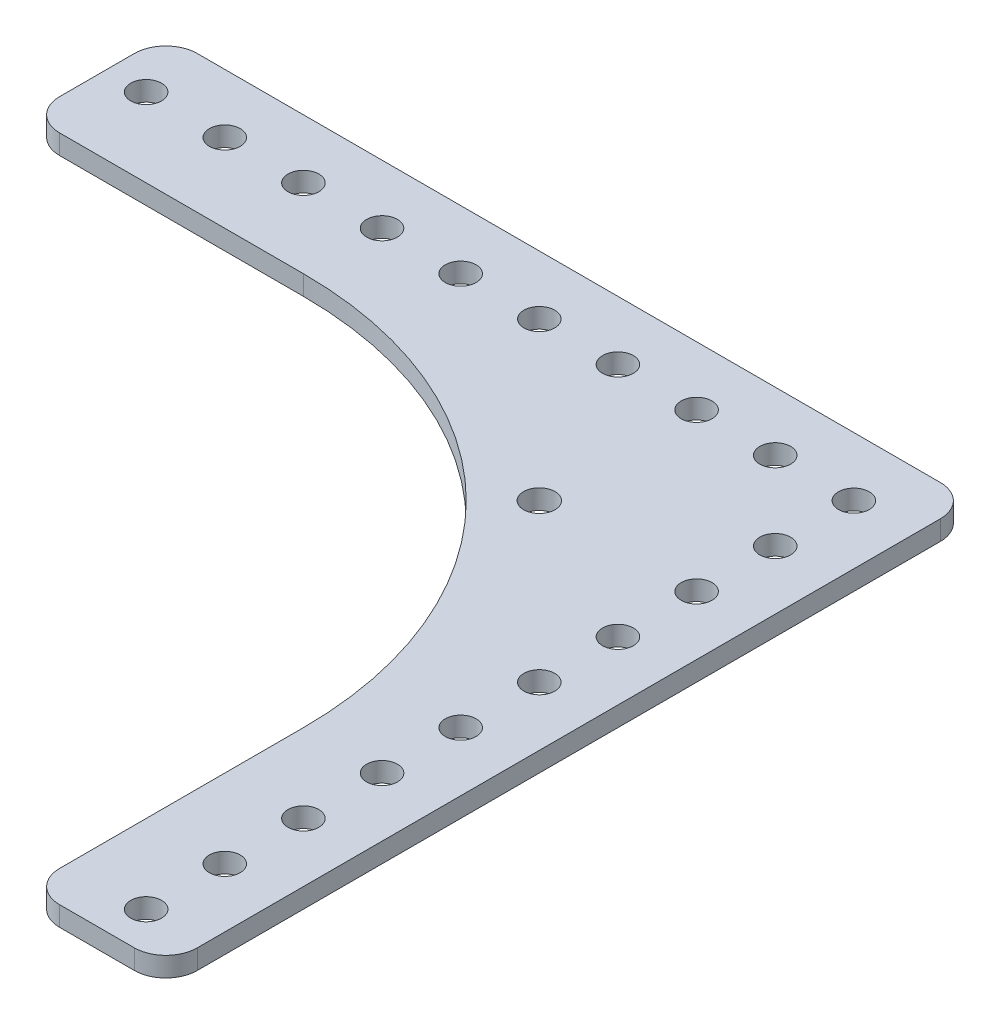
ISO-10303-21;
HEADER;
FILE_DESCRIPTION(('STEP AP214'),'2;1');
FILE_NAME('part.step','',(''),(''),'','','');
FILE_SCHEMA(('AUTOMOTIVE_DESIGN { 1 0 10303 214 1 1 1 1 }'));
ENDSEC;
DATA;
#1=APPLICATION_CONTEXT('core data for automotive mechanical design processes');
#2=APPLICATION_PROTOCOL_DEFINITION('international standard','automotive_design',2000,#1);
#3=PRODUCT_CONTEXT('',#1,'mechanical');
#4=PRODUCT('Part','Part','',(#3));
#5=PRODUCT_RELATED_PRODUCT_CATEGORY('part','',(#4));
#6=PRODUCT_DEFINITION_FORMATION('','',#4);
#7=PRODUCT_DEFINITION_CONTEXT('part definition',#1,'design');
#8=PRODUCT_DEFINITION('design','',#6,#7);
#9=PRODUCT_DEFINITION_SHAPE('','',#8);
#10=(LENGTH_UNIT() NAMED_UNIT(*) SI_UNIT(.MILLI.,.METRE.));
#11=(NAMED_UNIT(*) PLANE_ANGLE_UNIT() SI_UNIT($,.RADIAN.));
#12=(NAMED_UNIT(*) SI_UNIT($,.STERADIAN.) SOLID_ANGLE_UNIT());
#13=UNCERTAINTY_MEASURE_WITH_UNIT(LENGTH_MEASURE(1.E-05),#10,'distance_accuracy_value','');
#14=(GEOMETRIC_REPRESENTATION_CONTEXT(3) GLOBAL_UNCERTAINTY_ASSIGNED_CONTEXT((#13)) GLOBAL_UNIT_ASSIGNED_CONTEXT((#10,
#11,#12)) REPRESENTATION_CONTEXT('',''));
#15=CARTESIAN_POINT('',(0.,0.,0.));
#16=DIRECTION('',(0.,0.,1.));
#17=DIRECTION('',(1.,0.,0.));
#18=AXIS2_PLACEMENT_3D('',#15,#16,#17);
#19=CARTESIAN_POINT('',(0.,3.175,0.));
#20=DIRECTION('',(0.,-1.,0.));
#21=DIRECTION('',(0.,0.,-1.));
#22=AXIS2_PLACEMENT_3D('',#19,#20,#21);
#23=PLANE('',#22);
#24=CARTESIAN_POINT('',(-38.1,3.175,-76.1999999999992));
#25=DIRECTION('',(0.,1.,0.));
#26=DIRECTION('',(0.,0.,1.));
#27=AXIS2_PLACEMENT_3D('',#24,#25,#26);
#28=CIRCLE('',#27,2.4892);
#29=CARTESIAN_POINT('',(-38.1,3.175,-73.7107999999992));
#30=VERTEX_POINT('',#29);
#31=EDGE_CURVE('E302',#30,#30,#28,.T.);
#32=ORIENTED_EDGE('',*,*,#31,.F.);
#33=EDGE_LOOP('',(#32));
#34=FACE_BOUND('',#33,.T.);
#35=CARTESIAN_POINT('',(-12.7,3.175,-76.1999999999994));
#36=DIRECTION('',(0.,1.,0.));
#37=DIRECTION('',(0.,0.,1.));
#38=AXIS2_PLACEMENT_3D('',#35,#36,#37);
#39=CIRCLE('',#38,2.48920000000017);
#40=CARTESIAN_POINT('',(-12.7,3.175,-73.7107999999992));
#41=VERTEX_POINT('',#40);
#42=EDGE_CURVE('E309',#41,#41,#39,.T.);
#43=ORIENTED_EDGE('',*,*,#42,.F.);
#44=EDGE_LOOP('',(#43));
#45=FACE_BOUND('',#44,.T.);
#46=CARTESIAN_POINT('',(0.,3.175,-76.1999999999995));
#47=DIRECTION('',(0.,1.,0.));
#48=DIRECTION('',(0.,0.,1.));
#49=AXIS2_PLACEMENT_3D('',#46,#47,#48);
#50=CIRCLE('',#49,2.48920000000017);
#51=CARTESIAN_POINT('',(0.,3.175,-73.7107999999993));
#52=VERTEX_POINT('',#51);
#53=EDGE_CURVE('E315',#52,#52,#50,.T.);
#54=ORIENTED_EDGE('',*,*,#53,.F.);
#55=EDGE_LOOP('',(#54));
#56=FACE_BOUND('',#55,.T.);
#57=CARTESIAN_POINT('',(12.7,3.175,-76.1999999999996));
#58=DIRECTION('',(0.,1.,0.));
#59=DIRECTION('',(0.,0.,1.));
#60=AXIS2_PLACEMENT_3D('',#57,#58,#59);
#61=CIRCLE('',#60,2.48920000000017);
#62=CARTESIAN_POINT('',(12.7,3.175,-73.7107999999994));
#63=VERTEX_POINT('',#62);
#64=EDGE_CURVE('E321',#63,#63,#61,.T.);
#65=ORIENTED_EDGE('',*,*,#64,.F.);
#66=EDGE_LOOP('',(#65));
#67=FACE_BOUND('',#66,.T.);
#68=CARTESIAN_POINT('',(76.2,3.175,-25.4));
#69=DIRECTION('',(0.,1.,0.));
#70=DIRECTION('',(0.,0.,1.));
#71=AXIS2_PLACEMENT_3D('',#68,#69,#70);
#72=CIRCLE('',#71,2.4892);
#73=CARTESIAN_POINT('',(76.2,3.175,-22.9108));
#74=VERTEX_POINT('',#73);
#75=EDGE_CURVE('E327',#74,#74,#72,.T.);
#76=ORIENTED_EDGE('',*,*,#75,.F.);
#77=EDGE_LOOP('',(#76));
#78=FACE_BOUND('',#77,.T.);
#79=CARTESIAN_POINT('',(76.2,3.175,-12.7));
#80=DIRECTION('',(0.,1.,0.));
#81=DIRECTION('',(0.,0.,1.));
#82=AXIS2_PLACEMENT_3D('',#79,#80,#81);
#83=CIRCLE('',#82,2.4892);
#84=CARTESIAN_POINT('',(76.2,3.175,-10.2108));
#85=VERTEX_POINT('',#84);
#86=EDGE_CURVE('E333',#85,#85,#83,.T.);
#87=ORIENTED_EDGE('',*,*,#86,.F.);
#88=EDGE_LOOP('',(#87));
#89=FACE_BOUND('',#88,.T.);
#90=CARTESIAN_POINT('',(76.2,3.175,0.));
#91=DIRECTION('',(0.,1.,0.));
#92=DIRECTION('',(0.,0.,1.));
#93=AXIS2_PLACEMENT_3D('',#90,#91,#92);
#94=CIRCLE('',#93,2.4892);
#95=CARTESIAN_POINT('',(76.2,3.175,2.48920000000002));
#96=VERTEX_POINT('',#95);
#97=EDGE_CURVE('E339',#96,#96,#94,.T.);
#98=ORIENTED_EDGE('',*,*,#97,.F.);
#99=EDGE_LOOP('',(#98));
#100=FACE_BOUND('',#99,.T.);
#101=CARTESIAN_POINT('',(76.2,3.175,12.7));
#102=DIRECTION('',(0.,1.,0.));
#103=DIRECTION('',(0.,0.,1.));
#104=AXIS2_PLACEMENT_3D('',#101,#102,#103);
#105=CIRCLE('',#104,2.4892);
#106=CARTESIAN_POINT('',(76.2,3.175,15.1892));
#107=VERTEX_POINT('',#106);
#108=EDGE_CURVE('E345',#107,#107,#105,.T.);
#109=ORIENTED_EDGE('',*,*,#108,.F.);
#110=EDGE_LOOP('',(#109));
#111=FACE_BOUND('',#110,.T.);
#112=CARTESIAN_POINT('',(76.2,3.175,-76.2));
#113=DIRECTION('',(0.,1.,0.));
#114=DIRECTION('',(0.,0.,1.));
#115=AXIS2_PLACEMENT_3D('',#112,#113,#114);
#116=CIRCLE('',#115,2.4892);
#117=CARTESIAN_POINT('',(76.2,3.175,-73.7108));
#118=VERTEX_POINT('',#117);
#119=EDGE_CURVE('E273',#118,#118,#116,.T.);
#120=ORIENTED_EDGE('',*,*,#119,.F.);
#121=EDGE_LOOP('',(#120));
#122=FACE_BOUND('',#121,.T.);
#123=CARTESIAN_POINT('',(76.2,3.175,-63.5));
#124=DIRECTION('',(0.,1.,0.));
#125=DIRECTION('',(0.,0.,1.));
#126=AXIS2_PLACEMENT_3D('',#123,#124,#125);
#127=CIRCLE('',#126,2.4892);
#128=CARTESIAN_POINT('',(76.2,3.175,-61.0108));
#129=VERTEX_POINT('',#128);
#130=EDGE_CURVE('E267',#129,#129,#127,.T.);
#131=ORIENTED_EDGE('',*,*,#130,.F.);
#132=EDGE_LOOP('',(#131));
#133=FACE_BOUND('',#132,.T.);
#134=CARTESIAN_POINT('',(76.2,3.175,-50.8));
#135=DIRECTION('',(0.,1.,0.));
#136=DIRECTION('',(0.,0.,1.));
#137=AXIS2_PLACEMENT_3D('',#134,#135,#136);
#138=CIRCLE('',#137,2.4892);
#139=CARTESIAN_POINT('',(76.2,3.175,-48.3108));
#140=VERTEX_POINT('',#139);
#141=EDGE_CURVE('E261',#140,#140,#138,.T.);
#142=ORIENTED_EDGE('',*,*,#141,.F.);
#143=EDGE_LOOP('',(#142));
#144=FACE_BOUND('',#143,.T.);
#145=CARTESIAN_POINT('',(76.2,3.175,-38.1));
#146=DIRECTION('',(0.,1.,0.));
#147=DIRECTION('',(0.,0.,1.));
#148=AXIS2_PLACEMENT_3D('',#145,#146,#147);
#149=CIRCLE('',#148,2.4892);
#150=CARTESIAN_POINT('',(76.2,3.175,-35.6108));
#151=VERTEX_POINT('',#150);
#152=EDGE_CURVE('E254',#151,#151,#149,.T.);
#153=ORIENTED_EDGE('',*,*,#152,.F.);
#154=EDGE_LOOP('',(#153));
#155=FACE_BOUND('',#154,.T.);
#156=CARTESIAN_POINT('',(76.2,3.175,25.4));
#157=DIRECTION('',(0.,1.,0.));
#158=DIRECTION('',(0.,0.,1.));
#159=AXIS2_PLACEMENT_3D('',#156,#157,#158);
#160=CIRCLE('',#159,2.4892);
#161=CARTESIAN_POINT('',(76.2,3.175,27.8892));
#162=VERTEX_POINT('',#161);
#163=EDGE_CURVE('E290',#162,#162,#160,.T.);
#164=ORIENTED_EDGE('',*,*,#163,.F.);
#165=EDGE_LOOP('',(#164));
#166=FACE_BOUND('',#165,.T.);
#167=CARTESIAN_POINT('',(25.4,3.175,-76.1999999999996));
#168=DIRECTION('',(0.,1.,0.));
#169=DIRECTION('',(0.,0.,1.));
#170=AXIS2_PLACEMENT_3D('',#167,#168,#169);
#171=CIRCLE('',#170,2.48919999999995);
#172=CARTESIAN_POINT('',(25.4,3.175,-73.7107999999997));
#173=VERTEX_POINT('',#172);
#174=EDGE_CURVE('E297',#173,#173,#171,.T.);
#175=ORIENTED_EDGE('',*,*,#174,.F.);
#176=EDGE_LOOP('',(#175));
#177=FACE_BOUND('',#176,.T.);
#178=CARTESIAN_POINT('',(38.1,3.175,-76.1999999999997));
#179=DIRECTION('',(0.,1.,0.));
#180=DIRECTION('',(0.,0.,1.));
#181=AXIS2_PLACEMENT_3D('',#178,#179,#180);
#182=CIRCLE('',#181,2.48919999999995);
#183=CARTESIAN_POINT('',(38.1,3.175,-73.7107999999998));
#184=VERTEX_POINT('',#183);
#185=EDGE_CURVE('E278',#184,#184,#182,.T.);
#186=ORIENTED_EDGE('',*,*,#185,.F.);
#187=EDGE_LOOP('',(#186));
#188=FACE_BOUND('',#187,.T.);
#189=CARTESIAN_POINT('',(50.8,3.175,-76.1999999999998));
#190=DIRECTION('',(0.,1.,0.));
#191=DIRECTION('',(0.,0.,1.));
#192=AXIS2_PLACEMENT_3D('',#189,#190,#191);
#193=CIRCLE('',#192,2.4892);
#194=CARTESIAN_POINT('',(50.8,3.175,-73.7107999999998));
#195=VERTEX_POINT('',#194);
#196=EDGE_CURVE('E285',#195,#195,#193,.T.);
#197=ORIENTED_EDGE('',*,*,#196,.F.);
#198=EDGE_LOOP('',(#197));
#199=FACE_BOUND('',#198,.T.);
#200=CARTESIAN_POINT('',(-25.4,3.175,-76.1999999999993));
#201=DIRECTION('',(0.,1.,0.));
#202=DIRECTION('',(0.,0.,1.));
#203=AXIS2_PLACEMENT_3D('',#200,#201,#202);
#204=CIRCLE('',#203,2.48920000000017);
#205=CARTESIAN_POINT('',(-25.4,3.175,-73.7107999999991));
#206=VERTEX_POINT('',#205);
#207=EDGE_CURVE('E356',#206,#206,#204,.T.);
#208=ORIENTED_EDGE('',*,*,#207,.F.);
#209=EDGE_LOOP('',(#208));
#210=FACE_BOUND('',#209,.T.);
#211=CARTESIAN_POINT('',(76.2,3.175,38.1));
#212=DIRECTION('',(0.,1.,0.));
#213=DIRECTION('',(0.,0.,1.));
#214=AXIS2_PLACEMENT_3D('',#211,#212,#213);
#215=CIRCLE('',#214,2.4892);
#216=CARTESIAN_POINT('',(76.2,3.175,40.5892));
#217=VERTEX_POINT('',#216);
#218=EDGE_CURVE('E350',#217,#217,#215,.T.);
#219=ORIENTED_EDGE('',*,*,#218,.F.);
#220=EDGE_LOOP('',(#219));
#221=FACE_BOUND('',#220,.T.);
#222=CARTESIAN_POINT('',(63.5,3.175,-76.1999999999999));
#223=DIRECTION('',(0.,1.,0.));
#224=DIRECTION('',(0.,0.,1.));
#225=AXIS2_PLACEMENT_3D('',#222,#223,#224);
#226=CIRCLE('',#225,2.4892);
#227=CARTESIAN_POINT('',(63.5,3.175,-73.7107999999999));
#228=VERTEX_POINT('',#227);
#229=EDGE_CURVE('E196',#228,#228,#226,.T.);
#230=ORIENTED_EDGE('',*,*,#229,.F.);
#231=EDGE_LOOP('',(#230));
#232=FACE_BOUND('',#231,.T.);
#233=DIRECTION('',(0.,0.,1.));
#234=VECTOR('',#233,1.);
#235=CARTESIAN_POINT('',(63.5,3.175,33.0200000000001));
#236=LINE('',#235,#234);
#237=CARTESIAN_POINT('',(63.5,3.175,0.));
#238=VERTEX_POINT('',#237);
#239=CARTESIAN_POINT('',(63.5,3.175,39.37));
#240=VERTEX_POINT('',#239);
#241=EDGE_CURVE('E171',#238,#240,#236,.T.);
#242=ORIENTED_EDGE('',*,*,#241,.T.);
#243=CARTESIAN_POINT('',(68.58,3.175,39.37));
#244=DIRECTION('',(0.,1.,0.));
#245=DIRECTION('',(0.,0.,1.));
#246=AXIS2_PLACEMENT_3D('',#243,#244,#245);
#247=CIRCLE('',#246,5.08);
#248=CARTESIAN_POINT('',(68.58,3.175,44.45));
#249=VERTEX_POINT('',#248);
#250=EDGE_CURVE('E153',#240,#249,#247,.T.);
#251=ORIENTED_EDGE('',*,*,#250,.T.);
#252=DIRECTION('',(1.,0.,0.));
#253=VECTOR('',#252,1.);
#254=CARTESIAN_POINT('',(0.,3.175,44.45));
#255=LINE('',#254,#253);
#256=CARTESIAN_POINT('',(80.645,3.175,44.45));
#257=VERTEX_POINT('',#256);
#258=EDGE_CURVE('E233',#249,#257,#255,.T.);
#259=ORIENTED_EDGE('',*,*,#258,.T.);
#260=CARTESIAN_POINT('',(80.645,3.175,39.37));
#261=DIRECTION('',(0.,1.,0.));
#262=DIRECTION('',(0.,0.,1.));
#263=AXIS2_PLACEMENT_3D('',#260,#261,#262);
#264=CIRCLE('',#263,5.08);
#265=CARTESIAN_POINT('',(85.725,3.175,39.37));
#266=VERTEX_POINT('',#265);
#267=EDGE_CURVE('E157',#257,#266,#264,.T.);
#268=ORIENTED_EDGE('',*,*,#267,.T.);
#269=DIRECTION('',(0.,0.,1.));
#270=VECTOR('',#269,1.);
#271=CARTESIAN_POINT('',(85.725,3.175,0.));
#272=LINE('',#271,#270);
#273=CARTESIAN_POINT('',(85.725,3.175,-80.645));
#274=VERTEX_POINT('',#273);
#275=EDGE_CURVE('E224',#274,#266,#272,.T.);
#276=ORIENTED_EDGE('',*,*,#275,.F.);
#277=CARTESIAN_POINT('',(80.645,3.175,-80.645));
#278=DIRECTION('',(0.,1.,0.));
#279=DIRECTION('',(0.,0.,1.));
#280=AXIS2_PLACEMENT_3D('',#277,#278,#279);
#281=CIRCLE('',#280,5.08);
#282=CARTESIAN_POINT('',(80.645,3.175,-85.725));
#283=VERTEX_POINT('',#282);
#284=EDGE_CURVE('E221',#283,#274,#281,.F.);
#285=ORIENTED_EDGE('',*,*,#284,.F.);
#286=DIRECTION('',(1.,0.,0.));
#287=VECTOR('',#286,1.);
#288=CARTESIAN_POINT('',(0.,3.175,-85.725));
#289=LINE('',#288,#287);
#290=CARTESIAN_POINT('',(-39.3700000000001,3.175,-85.725));
#291=VERTEX_POINT('',#290);
#292=EDGE_CURVE('E205',#291,#283,#289,.T.);
#293=ORIENTED_EDGE('',*,*,#292,.F.);
#294=CARTESIAN_POINT('',(-39.3700000000001,3.175,-80.645));
#295=DIRECTION('',(0.,1.,0.));
#296=DIRECTION('',(0.,0.,1.));
#297=AXIS2_PLACEMENT_3D('',#294,#295,#296);
#298=CIRCLE('',#297,5.08);
#299=CARTESIAN_POINT('',(-44.4500000000002,3.175,-80.645));
#300=VERTEX_POINT('',#299);
#301=EDGE_CURVE('E154',#291,#300,#298,.T.);
#302=ORIENTED_EDGE('',*,*,#301,.T.);
#303=DIRECTION('',(0.,0.,-1.));
#304=VECTOR('',#303,1.);
#305=CARTESIAN_POINT('',(-44.4500000000001,3.175,0.));
#306=LINE('',#305,#304);
#307=CARTESIAN_POINT('',(-44.4500000000001,3.175,-68.58));
#308=VERTEX_POINT('',#307);
#309=EDGE_CURVE('E185',#308,#300,#306,.T.);
#310=ORIENTED_EDGE('',*,*,#309,.F.);
#311=CARTESIAN_POINT('',(-39.3700000000001,3.175,-68.58));
#312=DIRECTION('',(0.,1.,0.));
#313=DIRECTION('',(0.,0.,1.));
#314=AXIS2_PLACEMENT_3D('',#311,#312,#313);
#315=CIRCLE('',#314,5.08);
#316=CARTESIAN_POINT('',(-39.3700000000001,3.175,-63.5));
#317=VERTEX_POINT('',#316);
#318=EDGE_CURVE('E168',#317,#308,#315,.F.);
#319=ORIENTED_EDGE('',*,*,#318,.F.);
#320=DIRECTION('',(1.,0.,0.));
#321=VECTOR('',#320,1.);
#322=CARTESIAN_POINT('',(0.,3.175,-63.5));
#323=LINE('',#322,#321);
#324=CARTESIAN_POINT('',(0.,3.175,-63.5));
#325=VERTEX_POINT('',#324);
#326=EDGE_CURVE('E57',#317,#325,#323,.T.);
#327=ORIENTED_EDGE('',*,*,#326,.T.);
#328=CARTESIAN_POINT('',(0.,3.175,0.));
#329=DIRECTION('',(0.,-1.,0.));
#330=DIRECTION('',(0.,0.,-1.));
#331=AXIS2_PLACEMENT_3D('',#328,#329,#330);
#332=CIRCLE('',#331,63.5);
#333=EDGE_CURVE('E169',#325,#238,#332,.T.);
#334=ORIENTED_EDGE('',*,*,#333,.T.);
#335=EDGE_LOOP('',(#242,#251,#259,#268,#276,#285,#293,#302,#310,#319,#327,#334));
#336=FACE_BOUND('',#335,.T.);
#337=CARTESIAN_POINT('',(50.799999999898,3.175,-50.8000000001722));
#338=DIRECTION('',(0.,1.,0.));
#339=DIRECTION('',(0.,0.,1.));
#340=AXIS2_PLACEMENT_3D('',#337,#338,#339);
#341=CIRCLE('',#340,2.53999999999996);
#342=CARTESIAN_POINT('',(50.799999999898,3.175,-48.2600000001722));
#343=VERTEX_POINT('',#342);
#344=EDGE_CURVE('E162',#343,#343,#341,.T.);
#345=ORIENTED_EDGE('',*,*,#344,.F.);
#346=EDGE_LOOP('',(#345));
#347=FACE_BOUND('',#346,.T.);
#348=ADVANCED_FACE('F40',(#34,#45,#56,#67,#78,#89,#100,#111,#122,#133,#144,#155,#166,#177,#188,
#199,#210,#221,#232,#336,#347),#23,.F.);
#349=CARTESIAN_POINT('',(0.,0.,0.));
#350=DIRECTION('',(0.,-1.,0.));
#351=DIRECTION('',(0.,0.,-1.));
#352=AXIS2_PLACEMENT_3D('',#349,#350,#351);
#353=PLANE('',#352);
#354=CARTESIAN_POINT('',(-38.1,0.,-76.1999999999992));
#355=DIRECTION('',(0.,1.,0.));
#356=DIRECTION('',(0.,0.,1.));
#357=AXIS2_PLACEMENT_3D('',#354,#355,#356);
#358=CIRCLE('',#357,2.4892);
#359=CARTESIAN_POINT('',(-38.1,0.,-73.7107999999992));
#360=VERTEX_POINT('',#359);
#361=EDGE_CURVE('E305',#360,#360,#358,.T.);
#362=ORIENTED_EDGE('',*,*,#361,.T.);
#363=EDGE_LOOP('',(#362));
#364=FACE_BOUND('',#363,.T.);
#365=CARTESIAN_POINT('',(-12.7,0.,-76.1999999999994));
#366=DIRECTION('',(0.,1.,0.));
#367=DIRECTION('',(0.,0.,1.));
#368=AXIS2_PLACEMENT_3D('',#365,#366,#367);
#369=CIRCLE('',#368,2.48920000000017);
#370=CARTESIAN_POINT('',(-12.7,0.,-73.7107999999992));
#371=VERTEX_POINT('',#370);
#372=EDGE_CURVE('E312',#371,#371,#369,.T.);
#373=ORIENTED_EDGE('',*,*,#372,.T.);
#374=EDGE_LOOP('',(#373));
#375=FACE_BOUND('',#374,.T.);
#376=CARTESIAN_POINT('',(0.,0.,-76.1999999999995));
#377=DIRECTION('',(0.,1.,0.));
#378=DIRECTION('',(0.,0.,1.));
#379=AXIS2_PLACEMENT_3D('',#376,#377,#378);
#380=CIRCLE('',#379,2.48920000000017);
#381=CARTESIAN_POINT('',(0.,0.,-73.7107999999993));
#382=VERTEX_POINT('',#381);
#383=EDGE_CURVE('E318',#382,#382,#380,.T.);
#384=ORIENTED_EDGE('',*,*,#383,.T.);
#385=EDGE_LOOP('',(#384));
#386=FACE_BOUND('',#385,.T.);
#387=CARTESIAN_POINT('',(12.7,0.,-76.1999999999996));
#388=DIRECTION('',(0.,1.,0.));
#389=DIRECTION('',(0.,0.,1.));
#390=AXIS2_PLACEMENT_3D('',#387,#388,#389);
#391=CIRCLE('',#390,2.48920000000017);
#392=CARTESIAN_POINT('',(12.7,0.,-73.7107999999994));
#393=VERTEX_POINT('',#392);
#394=EDGE_CURVE('E324',#393,#393,#391,.T.);
#395=ORIENTED_EDGE('',*,*,#394,.T.);
#396=EDGE_LOOP('',(#395));
#397=FACE_BOUND('',#396,.T.);
#398=CARTESIAN_POINT('',(76.2,0.,-25.4));
#399=DIRECTION('',(0.,1.,0.));
#400=DIRECTION('',(0.,0.,1.));
#401=AXIS2_PLACEMENT_3D('',#398,#399,#400);
#402=CIRCLE('',#401,2.4892);
#403=CARTESIAN_POINT('',(76.2,0.,-22.9108));
#404=VERTEX_POINT('',#403);
#405=EDGE_CURVE('E330',#404,#404,#402,.T.);
#406=ORIENTED_EDGE('',*,*,#405,.T.);
#407=EDGE_LOOP('',(#406));
#408=FACE_BOUND('',#407,.T.);
#409=CARTESIAN_POINT('',(76.2,0.,-12.7));
#410=DIRECTION('',(0.,1.,0.));
#411=DIRECTION('',(0.,0.,1.));
#412=AXIS2_PLACEMENT_3D('',#409,#410,#411);
#413=CIRCLE('',#412,2.4892);
#414=CARTESIAN_POINT('',(76.2,0.,-10.2108));
#415=VERTEX_POINT('',#414);
#416=EDGE_CURVE('E336',#415,#415,#413,.T.);
#417=ORIENTED_EDGE('',*,*,#416,.T.);
#418=EDGE_LOOP('',(#417));
#419=FACE_BOUND('',#418,.T.);
#420=CARTESIAN_POINT('',(76.2,0.,0.));
#421=DIRECTION('',(0.,1.,0.));
#422=DIRECTION('',(0.,0.,1.));
#423=AXIS2_PLACEMENT_3D('',#420,#421,#422);
#424=CIRCLE('',#423,2.4892);
#425=CARTESIAN_POINT('',(76.2,0.,2.48920000000002));
#426=VERTEX_POINT('',#425);
#427=EDGE_CURVE('E342',#426,#426,#424,.T.);
#428=ORIENTED_EDGE('',*,*,#427,.T.);
#429=EDGE_LOOP('',(#428));
#430=FACE_BOUND('',#429,.T.);
#431=CARTESIAN_POINT('',(76.2,0.,12.7));
#432=DIRECTION('',(0.,1.,0.));
#433=DIRECTION('',(0.,0.,1.));
#434=AXIS2_PLACEMENT_3D('',#431,#432,#433);
#435=CIRCLE('',#434,2.4892);
#436=CARTESIAN_POINT('',(76.2,0.,15.1892));
#437=VERTEX_POINT('',#436);
#438=EDGE_CURVE('E294',#437,#437,#435,.T.);
#439=ORIENTED_EDGE('',*,*,#438,.T.);
#440=EDGE_LOOP('',(#439));
#441=FACE_BOUND('',#440,.T.);
#442=CARTESIAN_POINT('',(76.2,0.,-76.2));
#443=DIRECTION('',(0.,1.,0.));
#444=DIRECTION('',(0.,0.,1.));
#445=AXIS2_PLACEMENT_3D('',#442,#443,#444);
#446=CIRCLE('',#445,2.4892);
#447=CARTESIAN_POINT('',(76.2,0.,-73.7108));
#448=VERTEX_POINT('',#447);
#449=EDGE_CURVE('E252',#448,#448,#446,.T.);
#450=ORIENTED_EDGE('',*,*,#449,.T.);
#451=EDGE_LOOP('',(#450));
#452=FACE_BOUND('',#451,.T.);
#453=CARTESIAN_POINT('',(76.2,0.,-63.5));
#454=DIRECTION('',(0.,1.,0.));
#455=DIRECTION('',(0.,0.,1.));
#456=AXIS2_PLACEMENT_3D('',#453,#454,#455);
#457=CIRCLE('',#456,2.4892);
#458=CARTESIAN_POINT('',(76.2,0.,-61.0108));
#459=VERTEX_POINT('',#458);
#460=EDGE_CURVE('E270',#459,#459,#457,.T.);
#461=ORIENTED_EDGE('',*,*,#460,.T.);
#462=EDGE_LOOP('',(#461));
#463=FACE_BOUND('',#462,.T.);
#464=CARTESIAN_POINT('',(76.2,0.,-50.8));
#465=DIRECTION('',(0.,1.,0.));
#466=DIRECTION('',(0.,0.,1.));
#467=AXIS2_PLACEMENT_3D('',#464,#465,#466);
#468=CIRCLE('',#467,2.4892);
#469=CARTESIAN_POINT('',(76.2,0.,-48.3108));
#470=VERTEX_POINT('',#469);
#471=EDGE_CURVE('E264',#470,#470,#468,.T.);
#472=ORIENTED_EDGE('',*,*,#471,.T.);
#473=EDGE_LOOP('',(#472));
#474=FACE_BOUND('',#473,.T.);
#475=CARTESIAN_POINT('',(76.2,0.,-38.1));
#476=DIRECTION('',(0.,1.,0.));
#477=DIRECTION('',(0.,0.,1.));
#478=AXIS2_PLACEMENT_3D('',#475,#476,#477);
#479=CIRCLE('',#478,2.4892);
#480=CARTESIAN_POINT('',(76.2,0.,-35.6108));
#481=VERTEX_POINT('',#480);
#482=EDGE_CURVE('E257',#481,#481,#479,.T.);
#483=ORIENTED_EDGE('',*,*,#482,.T.);
#484=EDGE_LOOP('',(#483));
#485=FACE_BOUND('',#484,.T.);
#486=CARTESIAN_POINT('',(76.2,0.,25.4));
#487=DIRECTION('',(0.,1.,0.));
#488=DIRECTION('',(0.,0.,1.));
#489=AXIS2_PLACEMENT_3D('',#486,#487,#488);
#490=CIRCLE('',#489,2.4892);
#491=CARTESIAN_POINT('',(76.2,0.,27.8892));
#492=VERTEX_POINT('',#491);
#493=EDGE_CURVE('E293',#492,#492,#490,.T.);
#494=ORIENTED_EDGE('',*,*,#493,.T.);
#495=EDGE_LOOP('',(#494));
#496=FACE_BOUND('',#495,.T.);
#497=CARTESIAN_POINT('',(25.4,0.,-76.1999999999996));
#498=DIRECTION('',(0.,1.,0.));
#499=DIRECTION('',(0.,0.,1.));
#500=AXIS2_PLACEMENT_3D('',#497,#498,#499);
#501=CIRCLE('',#500,2.48919999999995);
#502=CARTESIAN_POINT('',(25.4,0.,-73.7107999999997));
#503=VERTEX_POINT('',#502);
#504=EDGE_CURVE('E282',#503,#503,#501,.T.);
#505=ORIENTED_EDGE('',*,*,#504,.T.);
#506=EDGE_LOOP('',(#505));
#507=FACE_BOUND('',#506,.T.);
#508=CARTESIAN_POINT('',(38.1,0.,-76.1999999999997));
#509=DIRECTION('',(0.,1.,0.));
#510=DIRECTION('',(0.,0.,1.));
#511=AXIS2_PLACEMENT_3D('',#508,#509,#510);
#512=CIRCLE('',#511,2.48919999999995);
#513=CARTESIAN_POINT('',(38.1,0.,-73.7107999999998));
#514=VERTEX_POINT('',#513);
#515=EDGE_CURVE('E281',#514,#514,#512,.T.);
#516=ORIENTED_EDGE('',*,*,#515,.T.);
#517=EDGE_LOOP('',(#516));
#518=FACE_BOUND('',#517,.T.);
#519=CARTESIAN_POINT('',(50.8,0.,-76.1999999999998));
#520=DIRECTION('',(0.,1.,0.));
#521=DIRECTION('',(0.,0.,1.));
#522=AXIS2_PLACEMENT_3D('',#519,#520,#521);
#523=CIRCLE('',#522,2.4892);
#524=CARTESIAN_POINT('',(50.8,0.,-73.7107999999998));
#525=VERTEX_POINT('',#524);
#526=EDGE_CURVE('E258',#525,#525,#523,.T.);
#527=ORIENTED_EDGE('',*,*,#526,.T.);
#528=EDGE_LOOP('',(#527));
#529=FACE_BOUND('',#528,.T.);
#530=CARTESIAN_POINT('',(-25.4,0.,-76.1999999999993));
#531=DIRECTION('',(0.,1.,0.));
#532=DIRECTION('',(0.,0.,1.));
#533=AXIS2_PLACEMENT_3D('',#530,#531,#532);
#534=CIRCLE('',#533,2.48920000000017);
#535=CARTESIAN_POINT('',(-25.4,0.,-73.7107999999991));
#536=VERTEX_POINT('',#535);
#537=EDGE_CURVE('E306',#536,#536,#534,.T.);
#538=ORIENTED_EDGE('',*,*,#537,.T.);
#539=EDGE_LOOP('',(#538));
#540=FACE_BOUND('',#539,.T.);
#541=CARTESIAN_POINT('',(76.2,0.,38.1));
#542=DIRECTION('',(0.,1.,0.));
#543=DIRECTION('',(0.,0.,1.));
#544=AXIS2_PLACEMENT_3D('',#541,#542,#543);
#545=CIRCLE('',#544,2.4892);
#546=CARTESIAN_POINT('',(76.2,0.,40.5892));
#547=VERTEX_POINT('',#546);
#548=EDGE_CURVE('E353',#547,#547,#545,.T.);
#549=ORIENTED_EDGE('',*,*,#548,.T.);
#550=EDGE_LOOP('',(#549));
#551=FACE_BOUND('',#550,.T.);
#552=CARTESIAN_POINT('',(63.5,0.,-76.1999999999999));
#553=DIRECTION('',(0.,1.,0.));
#554=DIRECTION('',(0.,0.,1.));
#555=AXIS2_PLACEMENT_3D('',#552,#553,#554);
#556=CIRCLE('',#555,2.4892);
#557=CARTESIAN_POINT('',(63.5,0.,-73.7107999999999));
#558=VERTEX_POINT('',#557);
#559=EDGE_CURVE('E191',#558,#558,#556,.T.);
#560=ORIENTED_EDGE('',*,*,#559,.T.);
#561=EDGE_LOOP('',(#560));
#562=FACE_BOUND('',#561,.T.);
#563=CARTESIAN_POINT('',(68.58,0.,39.37));
#564=DIRECTION('',(0.,-1.,0.));
#565=DIRECTION('',(0.,0.,-1.));
#566=AXIS2_PLACEMENT_3D('',#563,#564,#565);
#567=CIRCLE('',#566,5.08);
#568=CARTESIAN_POINT('',(63.5,0.,39.37));
#569=VERTEX_POINT('',#568);
#570=CARTESIAN_POINT('',(68.58,0.,44.45));
#571=VERTEX_POINT('',#570);
#572=EDGE_CURVE('E142',#569,#571,#567,.F.);
#573=ORIENTED_EDGE('',*,*,#572,.F.);
#574=DIRECTION('',(0.,0.,1.));
#575=VECTOR('',#574,1.);
#576=CARTESIAN_POINT('',(63.5,0.,33.0200000000001));
#577=LINE('',#576,#575);
#578=CARTESIAN_POINT('',(63.5,0.,0.));
#579=VERTEX_POINT('',#578);
#580=EDGE_CURVE('E69',#579,#569,#577,.T.);
#581=ORIENTED_EDGE('',*,*,#580,.F.);
#582=CARTESIAN_POINT('',(0.,0.,0.));
#583=DIRECTION('',(0.,-1.,0.));
#584=DIRECTION('',(0.,0.,-1.));
#585=AXIS2_PLACEMENT_3D('',#582,#583,#584);
#586=CIRCLE('',#585,63.5);
#587=CARTESIAN_POINT('',(0.,0.,-63.5));
#588=VERTEX_POINT('',#587);
#589=EDGE_CURVE('E139',#588,#579,#586,.T.);
#590=ORIENTED_EDGE('',*,*,#589,.F.);
#591=DIRECTION('',(1.,0.,0.));
#592=VECTOR('',#591,1.);
#593=CARTESIAN_POINT('',(0.,0.,-63.5));
#594=LINE('',#593,#592);
#595=CARTESIAN_POINT('',(-39.3700000000001,0.,-63.5));
#596=VERTEX_POINT('',#595);
#597=EDGE_CURVE('E138',#596,#588,#594,.T.);
#598=ORIENTED_EDGE('',*,*,#597,.F.);
#599=CARTESIAN_POINT('',(-39.3700000000001,0.,-68.58));
#600=DIRECTION('',(0.,-1.,0.));
#601=DIRECTION('',(0.,0.,-1.));
#602=AXIS2_PLACEMENT_3D('',#599,#600,#601);
#603=CIRCLE('',#602,5.08);
#604=CARTESIAN_POINT('',(-44.4500000000001,0.,-68.58));
#605=VERTEX_POINT('',#604);
#606=EDGE_CURVE('E179',#596,#605,#603,.T.);
#607=ORIENTED_EDGE('',*,*,#606,.T.);
#608=DIRECTION('',(0.,0.,-1.));
#609=VECTOR('',#608,1.);
#610=CARTESIAN_POINT('',(-44.4500000000001,0.,0.));
#611=LINE('',#610,#609);
#612=CARTESIAN_POINT('',(-44.4500000000002,0.,-80.645));
#613=VERTEX_POINT('',#612);
#614=EDGE_CURVE('E190',#605,#613,#611,.T.);
#615=ORIENTED_EDGE('',*,*,#614,.T.);
#616=CARTESIAN_POINT('',(-39.3700000000001,0.,-80.645));
#617=DIRECTION('',(0.,-1.,0.));
#618=DIRECTION('',(0.,0.,-1.));
#619=AXIS2_PLACEMENT_3D('',#616,#617,#618);
#620=CIRCLE('',#619,5.08);
#621=CARTESIAN_POINT('',(-39.3700000000001,0.,-85.725));
#622=VERTEX_POINT('',#621);
#623=EDGE_CURVE('E201',#622,#613,#620,.F.);
#624=ORIENTED_EDGE('',*,*,#623,.F.);
#625=DIRECTION('',(1.,0.,0.));
#626=VECTOR('',#625,1.);
#627=CARTESIAN_POINT('',(0.,0.,-85.725));
#628=LINE('',#627,#626);
#629=CARTESIAN_POINT('',(80.645,0.,-85.725));
#630=VERTEX_POINT('',#629);
#631=EDGE_CURVE('E193',#622,#630,#628,.T.);
#632=ORIENTED_EDGE('',*,*,#631,.T.);
#633=CARTESIAN_POINT('',(80.645,0.,-80.645));
#634=DIRECTION('',(0.,-1.,0.));
#635=DIRECTION('',(0.,0.,-1.));
#636=AXIS2_PLACEMENT_3D('',#633,#634,#635);
#637=CIRCLE('',#636,5.08);
#638=CARTESIAN_POINT('',(85.725,0.,-80.645));
#639=VERTEX_POINT('',#638);
#640=EDGE_CURVE('E207',#630,#639,#637,.T.);
#641=ORIENTED_EDGE('',*,*,#640,.T.);
#642=DIRECTION('',(0.,0.,1.));
#643=VECTOR('',#642,1.);
#644=CARTESIAN_POINT('',(85.725,0.,0.));
#645=LINE('',#644,#643);
#646=CARTESIAN_POINT('',(85.725,0.,39.37));
#647=VERTEX_POINT('',#646);
#648=EDGE_CURVE('E209',#639,#647,#645,.T.);
#649=ORIENTED_EDGE('',*,*,#648,.T.);
#650=CARTESIAN_POINT('',(80.645,0.,39.37));
#651=DIRECTION('',(0.,-1.,0.));
#652=DIRECTION('',(0.,0.,-1.));
#653=AXIS2_PLACEMENT_3D('',#650,#651,#652);
#654=CIRCLE('',#653,5.08);
#655=CARTESIAN_POINT('',(80.645,0.,44.45));
#656=VERTEX_POINT('',#655);
#657=EDGE_CURVE('E211',#656,#647,#654,.F.);
#658=ORIENTED_EDGE('',*,*,#657,.F.);
#659=DIRECTION('',(1.,0.,0.));
#660=VECTOR('',#659,1.);
#661=CARTESIAN_POINT('',(0.,0.,44.45));
#662=LINE('',#661,#660);
#663=EDGE_CURVE('E146',#571,#656,#662,.T.);
#664=ORIENTED_EDGE('',*,*,#663,.F.);
#665=EDGE_LOOP('',(#573,#581,#590,#598,#607,#615,#624,#632,#641,#649,#658,#664));
#666=FACE_BOUND('',#665,.T.);
#667=CARTESIAN_POINT('',(50.799999999898,0.,-50.8000000001722));
#668=DIRECTION('',(0.,1.,0.));
#669=DIRECTION('',(0.,0.,1.));
#670=AXIS2_PLACEMENT_3D('',#667,#668,#669);
#671=CIRCLE('',#670,2.53999999999996);
#672=CARTESIAN_POINT('',(50.799999999898,0.,-48.2600000001722));
#673=VERTEX_POINT('',#672);
#674=EDGE_CURVE('E165',#673,#673,#671,.T.);
#675=ORIENTED_EDGE('',*,*,#674,.T.);
#676=EDGE_LOOP('',(#675));
#677=FACE_BOUND('',#676,.T.);
#678=ADVANCED_FACE('F143',(#364,#375,#386,#397,#408,#419,#430,#441,#452,#463,#474,#485,#496,
#507,#518,#529,#540,#551,#562,#666,#677),#353,.T.);
#679=CARTESIAN_POINT('',(0.,3.175,0.));
#680=DIRECTION('',(0.,-1.,0.));
#681=DIRECTION('',(0.,0.,-1.));
#682=AXIS2_PLACEMENT_3D('',#679,#680,#681);
#683=CYLINDRICAL_SURFACE('',#682,63.5);
#684=ORIENTED_EDGE('',*,*,#589,.T.);
#685=DIRECTION('',(0.,-1.,0.));
#686=VECTOR('',#685,1.);
#687=CARTESIAN_POINT('',(63.5,3.175,0.));
#688=LINE('',#687,#686);
#689=EDGE_CURVE('E11',#238,#579,#688,.T.);
#690=ORIENTED_EDGE('',*,*,#689,.F.);
#691=ORIENTED_EDGE('',*,*,#333,.F.);
#692=DIRECTION('',(0.,-1.,0.));
#693=VECTOR('',#692,1.);
#694=CARTESIAN_POINT('',(0.,3.175,-63.5));
#695=LINE('',#694,#693);
#696=EDGE_CURVE('E49',#325,#588,#695,.T.);
#697=ORIENTED_EDGE('',*,*,#696,.T.);
#698=EDGE_LOOP('',(#684,#690,#691,#697));
#699=FACE_BOUND('',#698,.T.);
#700=ADVANCED_FACE('F42',(#699),#683,.F.);
#701=CARTESIAN_POINT('',(63.5,3.175,33.0200000000001));
#702=DIRECTION('',(1.,0.,0.));
#703=DIRECTION('',(0.,0.,-1.));
#704=AXIS2_PLACEMENT_3D('',#701,#702,#703);
#705=PLANE('',#704);
#706=ORIENTED_EDGE('',*,*,#580,.T.);
#707=DIRECTION('',(0.,1.,0.));
#708=VECTOR('',#707,1.);
#709=CARTESIAN_POINT('',(63.5,-184.095250481918,39.37));
#710=LINE('',#709,#708);
#711=EDGE_CURVE('E134',#569,#240,#710,.T.);
#712=ORIENTED_EDGE('',*,*,#711,.T.);
#713=ORIENTED_EDGE('',*,*,#241,.F.);
#714=ORIENTED_EDGE('',*,*,#689,.T.);
#715=EDGE_LOOP('',(#706,#712,#713,#714));
#716=FACE_BOUND('',#715,.T.);
#717=ADVANCED_FACE('F132',(#716),#705,.F.);
#718=CARTESIAN_POINT('',(0.,3.175,-63.5));
#719=DIRECTION('',(0.,0.,-1.));
#720=DIRECTION('',(-1.,0.,0.));
#721=AXIS2_PLACEMENT_3D('',#718,#719,#720);
#722=PLANE('',#721);
#723=ORIENTED_EDGE('',*,*,#597,.T.);
#724=ORIENTED_EDGE('',*,*,#696,.F.);
#725=ORIENTED_EDGE('',*,*,#326,.F.);
#726=DIRECTION('',(0.,1.,0.));
#727=VECTOR('',#726,1.);
#728=CARTESIAN_POINT('',(-39.3700000000001,-184.095250481918,-63.5));
#729=LINE('',#728,#727);
#730=EDGE_CURVE('E181',#596,#317,#729,.T.);
#731=ORIENTED_EDGE('',*,*,#730,.F.);
#732=EDGE_LOOP('',(#723,#724,#725,#731));
#733=FACE_BOUND('',#732,.T.);
#734=ADVANCED_FACE('F182',(#733),#722,.F.);
#735=CARTESIAN_POINT('',(50.799999999898,3.175,-50.8000000001722));
#736=DIRECTION('',(0.,-1.,0.));
#737=DIRECTION('',(0.,0.,-1.));
#738=AXIS2_PLACEMENT_3D('',#735,#736,#737);
#739=CYLINDRICAL_SURFACE('',#738,2.53999999999996);
#740=ORIENTED_EDGE('',*,*,#344,.T.);
#741=EDGE_LOOP('',(#740));
#742=FACE_BOUND('',#741,.T.);
#743=ORIENTED_EDGE('',*,*,#674,.F.);
#744=EDGE_LOOP('',(#743));
#745=FACE_BOUND('',#744,.T.);
#746=ADVANCED_FACE('F422',(#742,#745),#739,.F.);
#747=CARTESIAN_POINT('',(68.58,-184.095250481918,39.37));
#748=DIRECTION('',(0.,1.,0.));
#749=DIRECTION('',(0.,0.,1.));
#750=AXIS2_PLACEMENT_3D('',#747,#748,#749);
#751=CYLINDRICAL_SURFACE('',#750,5.08);
#752=ORIENTED_EDGE('',*,*,#711,.F.);
#753=ORIENTED_EDGE('',*,*,#572,.T.);
#754=DIRECTION('',(0.,1.,0.));
#755=VECTOR('',#754,1.);
#756=CARTESIAN_POINT('',(68.58,-184.095250481918,44.45));
#757=LINE('',#756,#755);
#758=EDGE_CURVE('E149',#571,#249,#757,.T.);
#759=ORIENTED_EDGE('',*,*,#758,.T.);
#760=ORIENTED_EDGE('',*,*,#250,.F.);
#761=EDGE_LOOP('',(#752,#753,#759,#760));
#762=FACE_BOUND('',#761,.T.);
#763=ADVANCED_FACE('F151',(#762),#751,.T.);
#764=CARTESIAN_POINT('',(0.,-184.095250481918,44.45));
#765=DIRECTION('',(0.,0.,1.));
#766=DIRECTION('',(1.,0.,0.));
#767=AXIS2_PLACEMENT_3D('',#764,#765,#766);
#768=PLANE('',#767);
#769=ORIENTED_EDGE('',*,*,#758,.F.);
#770=ORIENTED_EDGE('',*,*,#663,.T.);
#771=DIRECTION('',(0.,1.,0.));
#772=VECTOR('',#771,1.);
#773=CARTESIAN_POINT('',(80.645,-184.095250481918,44.45));
#774=LINE('',#773,#772);
#775=EDGE_CURVE('E215',#656,#257,#774,.T.);
#776=ORIENTED_EDGE('',*,*,#775,.T.);
#777=ORIENTED_EDGE('',*,*,#258,.F.);
#778=EDGE_LOOP('',(#769,#770,#776,#777));
#779=FACE_BOUND('',#778,.T.);
#780=ADVANCED_FACE('F231',(#779),#768,.T.);
#781=CARTESIAN_POINT('',(80.645,-184.095250481918,39.37));
#782=DIRECTION('',(0.,1.,0.));
#783=DIRECTION('',(0.,0.,1.));
#784=AXIS2_PLACEMENT_3D('',#781,#782,#783);
#785=CYLINDRICAL_SURFACE('',#784,5.08);
#786=ORIENTED_EDGE('',*,*,#775,.F.);
#787=ORIENTED_EDGE('',*,*,#657,.T.);
#788=DIRECTION('',(0.,1.,0.));
#789=VECTOR('',#788,1.);
#790=CARTESIAN_POINT('',(85.725,-184.095250481918,39.37));
#791=LINE('',#790,#789);
#792=EDGE_CURVE('E214',#647,#266,#791,.T.);
#793=ORIENTED_EDGE('',*,*,#792,.T.);
#794=ORIENTED_EDGE('',*,*,#267,.F.);
#795=EDGE_LOOP('',(#786,#787,#793,#794));
#796=FACE_BOUND('',#795,.T.);
#797=ADVANCED_FACE('F236',(#796),#785,.T.);
#798=CARTESIAN_POINT('',(85.725,-184.095250481918,0.));
#799=DIRECTION('',(-1.,0.,0.));
#800=DIRECTION('',(0.,0.,1.));
#801=AXIS2_PLACEMENT_3D('',#798,#799,#800);
#802=PLANE('',#801);
#803=ORIENTED_EDGE('',*,*,#648,.F.);
#804=DIRECTION('',(0.,1.,0.));
#805=VECTOR('',#804,1.);
#806=CARTESIAN_POINT('',(85.725,-184.095250481918,-80.645));
#807=LINE('',#806,#805);
#808=EDGE_CURVE('E225',#639,#274,#807,.T.);
#809=ORIENTED_EDGE('',*,*,#808,.T.);
#810=ORIENTED_EDGE('',*,*,#275,.T.);
#811=ORIENTED_EDGE('',*,*,#792,.F.);
#812=EDGE_LOOP('',(#803,#809,#810,#811));
#813=FACE_BOUND('',#812,.T.);
#814=ADVANCED_FACE('F411',(#813),#802,.F.);
#815=CARTESIAN_POINT('',(80.645,-184.095250481918,-80.645));
#816=DIRECTION('',(0.,1.,0.));
#817=DIRECTION('',(0.,0.,1.));
#818=AXIS2_PLACEMENT_3D('',#815,#816,#817);
#819=CYLINDRICAL_SURFACE('',#818,5.08);
#820=ORIENTED_EDGE('',*,*,#640,.F.);
#821=DIRECTION('',(0.,1.,0.));
#822=VECTOR('',#821,1.);
#823=CARTESIAN_POINT('',(80.645,-184.095250481918,-85.725));
#824=LINE('',#823,#822);
#825=EDGE_CURVE('E222',#630,#283,#824,.T.);
#826=ORIENTED_EDGE('',*,*,#825,.T.);
#827=ORIENTED_EDGE('',*,*,#284,.T.);
#828=ORIENTED_EDGE('',*,*,#808,.F.);
#829=EDGE_LOOP('',(#820,#826,#827,#828));
#830=FACE_BOUND('',#829,.T.);
#831=ADVANCED_FACE('F407',(#830),#819,.T.);
#832=CARTESIAN_POINT('',(0.,-184.095250481918,-85.725));
#833=DIRECTION('',(0.,0.,1.));
#834=DIRECTION('',(1.,0.,0.));
#835=AXIS2_PLACEMENT_3D('',#832,#833,#834);
#836=PLANE('',#835);
#837=ORIENTED_EDGE('',*,*,#631,.F.);
#838=DIRECTION('',(0.,1.,0.));
#839=VECTOR('',#838,1.);
#840=CARTESIAN_POINT('',(-39.3700000000001,-184.095250481918,-85.725));
#841=LINE('',#840,#839);
#842=EDGE_CURVE('E219',#622,#291,#841,.T.);
#843=ORIENTED_EDGE('',*,*,#842,.T.);
#844=ORIENTED_EDGE('',*,*,#292,.T.);
#845=ORIENTED_EDGE('',*,*,#825,.F.);
#846=EDGE_LOOP('',(#837,#843,#844,#845));
#847=FACE_BOUND('',#846,.T.);
#848=ADVANCED_FACE('F403',(#847),#836,.F.);
#849=CARTESIAN_POINT('',(-39.3700000000001,-184.095250481918,-80.645));
#850=DIRECTION('',(0.,1.,0.));
#851=DIRECTION('',(0.,0.,1.));
#852=AXIS2_PLACEMENT_3D('',#849,#850,#851);
#853=CYLINDRICAL_SURFACE('',#852,5.08);
#854=ORIENTED_EDGE('',*,*,#842,.F.);
#855=ORIENTED_EDGE('',*,*,#623,.T.);
#856=DIRECTION('',(0.,1.,0.));
#857=VECTOR('',#856,1.);
#858=CARTESIAN_POINT('',(-44.4500000000002,-184.095250481918,-80.645));
#859=LINE('',#858,#857);
#860=EDGE_CURVE('E204',#613,#300,#859,.T.);
#861=ORIENTED_EDGE('',*,*,#860,.T.);
#862=ORIENTED_EDGE('',*,*,#301,.F.);
#863=EDGE_LOOP('',(#854,#855,#861,#862));
#864=FACE_BOUND('',#863,.T.);
#865=ADVANCED_FACE('F399',(#864),#853,.T.);
#866=CARTESIAN_POINT('',(-44.4500000000001,-184.095250481918,0.));
#867=DIRECTION('',(1.,0.,0.));
#868=DIRECTION('',(0.,0.,-1.));
#869=AXIS2_PLACEMENT_3D('',#866,#867,#868);
#870=PLANE('',#869);
#871=ORIENTED_EDGE('',*,*,#614,.F.);
#872=DIRECTION('',(0.,1.,0.));
#873=VECTOR('',#872,1.);
#874=CARTESIAN_POINT('',(-44.4500000000001,-184.095250481918,-68.58));
#875=LINE('',#874,#873);
#876=EDGE_CURVE('E188',#605,#308,#875,.T.);
#877=ORIENTED_EDGE('',*,*,#876,.T.);
#878=ORIENTED_EDGE('',*,*,#309,.T.);
#879=ORIENTED_EDGE('',*,*,#860,.F.);
#880=EDGE_LOOP('',(#871,#877,#878,#879));
#881=FACE_BOUND('',#880,.T.);
#882=ADVANCED_FACE('F390',(#881),#870,.F.);
#883=CARTESIAN_POINT('',(-39.3700000000001,-184.095250481918,-68.58));
#884=DIRECTION('',(0.,1.,0.));
#885=DIRECTION('',(0.,0.,1.));
#886=AXIS2_PLACEMENT_3D('',#883,#884,#885);
#887=CYLINDRICAL_SURFACE('',#886,5.08);
#888=ORIENTED_EDGE('',*,*,#606,.F.);
#889=ORIENTED_EDGE('',*,*,#730,.T.);
#890=ORIENTED_EDGE('',*,*,#318,.T.);
#891=ORIENTED_EDGE('',*,*,#876,.F.);
#892=EDGE_LOOP('',(#888,#889,#890,#891));
#893=FACE_BOUND('',#892,.T.);
#894=ADVANCED_FACE('F187',(#893),#887,.T.);
#895=CARTESIAN_POINT('',(63.5,0.,-76.1999999999999));
#896=DIRECTION('',(0.,1.,0.));
#897=DIRECTION('',(0.,0.,1.));
#898=AXIS2_PLACEMENT_3D('',#895,#896,#897);
#899=CYLINDRICAL_SURFACE('',#898,2.4892);
#900=ORIENTED_EDGE('',*,*,#559,.F.);
#901=EDGE_LOOP('',(#900));
#902=FACE_BOUND('',#901,.T.);
#903=ORIENTED_EDGE('',*,*,#229,.T.);
#904=EDGE_LOOP('',(#903));
#905=FACE_BOUND('',#904,.T.);
#906=ADVANCED_FACE('F380',(#902,#905),#899,.F.);
#907=CARTESIAN_POINT('',(76.2,0.,38.1));
#908=DIRECTION('',(0.,1.,0.));
#909=DIRECTION('',(0.,0.,1.));
#910=AXIS2_PLACEMENT_3D('',#907,#908,#909);
#911=CYLINDRICAL_SURFACE('',#910,2.4892);
#912=ORIENTED_EDGE('',*,*,#548,.F.);
#913=EDGE_LOOP('',(#912));
#914=FACE_BOUND('',#913,.T.);
#915=ORIENTED_EDGE('',*,*,#218,.T.);
#916=EDGE_LOOP('',(#915));
#917=FACE_BOUND('',#916,.T.);
#918=ADVANCED_FACE('F368',(#914,#917),#911,.F.);
#919=CARTESIAN_POINT('',(-25.4,0.,-76.1999999999993));
#920=DIRECTION('',(0.,1.,0.));
#921=DIRECTION('',(0.,0.,1.));
#922=AXIS2_PLACEMENT_3D('',#919,#920,#921);
#923=CYLINDRICAL_SURFACE('',#922,2.48920000000017);
#924=ORIENTED_EDGE('',*,*,#537,.F.);
#925=EDGE_LOOP('',(#924));
#926=FACE_BOUND('',#925,.T.);
#927=ORIENTED_EDGE('',*,*,#207,.T.);
#928=EDGE_LOOP('',(#927));
#929=FACE_BOUND('',#928,.T.);
#930=ADVANCED_FACE('F364',(#926,#929),#923,.F.);
#931=CARTESIAN_POINT('',(50.8,0.,-76.1999999999998));
#932=DIRECTION('',(0.,1.,0.));
#933=DIRECTION('',(0.,0.,1.));
#934=AXIS2_PLACEMENT_3D('',#931,#932,#933);
#935=CYLINDRICAL_SURFACE('',#934,2.4892);
#936=ORIENTED_EDGE('',*,*,#526,.F.);
#937=EDGE_LOOP('',(#936));
#938=FACE_BOUND('',#937,.T.);
#939=ORIENTED_EDGE('',*,*,#196,.T.);
#940=EDGE_LOOP('',(#939));
#941=FACE_BOUND('',#940,.T.);
#942=ADVANCED_FACE('F367',(#938,#941),#935,.F.);
#943=CARTESIAN_POINT('',(38.1,0.,-76.1999999999997));
#944=DIRECTION('',(0.,1.,0.));
#945=DIRECTION('',(0.,0.,1.));
#946=AXIS2_PLACEMENT_3D('',#943,#944,#945);
#947=CYLINDRICAL_SURFACE('',#946,2.48919999999995);
#948=ORIENTED_EDGE('',*,*,#515,.F.);
#949=EDGE_LOOP('',(#948));
#950=FACE_BOUND('',#949,.T.);
#951=ORIENTED_EDGE('',*,*,#185,.T.);
#952=EDGE_LOOP('',(#951));
#953=FACE_BOUND('',#952,.T.);
#954=ADVANCED_FACE('F557',(#950,#953),#947,.F.);
#955=CARTESIAN_POINT('',(25.4,0.,-76.1999999999996));
#956=DIRECTION('',(0.,1.,0.));
#957=DIRECTION('',(0.,0.,1.));
#958=AXIS2_PLACEMENT_3D('',#955,#956,#957);
#959=CYLINDRICAL_SURFACE('',#958,2.48919999999995);
#960=ORIENTED_EDGE('',*,*,#504,.F.);
#961=EDGE_LOOP('',(#960));
#962=FACE_BOUND('',#961,.T.);
#963=ORIENTED_EDGE('',*,*,#174,.T.);
#964=EDGE_LOOP('',(#963));
#965=FACE_BOUND('',#964,.T.);
#966=ADVANCED_FACE('F566',(#962,#965),#959,.F.);
#967=CARTESIAN_POINT('',(76.2,0.,25.4));
#968=DIRECTION('',(0.,1.,0.));
#969=DIRECTION('',(0.,0.,1.));
#970=AXIS2_PLACEMENT_3D('',#967,#968,#969);
#971=CYLINDRICAL_SURFACE('',#970,2.4892);
#972=ORIENTED_EDGE('',*,*,#493,.F.);
#973=EDGE_LOOP('',(#972));
#974=FACE_BOUND('',#973,.T.);
#975=ORIENTED_EDGE('',*,*,#163,.T.);
#976=EDGE_LOOP('',(#975));
#977=FACE_BOUND('',#976,.T.);
#978=ADVANCED_FACE('F575',(#974,#977),#971,.F.);
#979=CARTESIAN_POINT('',(76.2,0.,-38.1));
#980=DIRECTION('',(0.,1.,0.));
#981=DIRECTION('',(0.,0.,1.));
#982=AXIS2_PLACEMENT_3D('',#979,#980,#981);
#983=CYLINDRICAL_SURFACE('',#982,2.4892);
#984=ORIENTED_EDGE('',*,*,#482,.F.);
#985=EDGE_LOOP('',(#984));
#986=FACE_BOUND('',#985,.T.);
#987=ORIENTED_EDGE('',*,*,#152,.T.);
#988=EDGE_LOOP('',(#987));
#989=FACE_BOUND('',#988,.T.);
#990=ADVANCED_FACE('F394',(#986,#989),#983,.F.);
#991=CARTESIAN_POINT('',(76.2,0.,-50.8));
#992=DIRECTION('',(0.,1.,0.));
#993=DIRECTION('',(0.,0.,1.));
#994=AXIS2_PLACEMENT_3D('',#991,#992,#993);
#995=CYLINDRICAL_SURFACE('',#994,2.4892);
#996=ORIENTED_EDGE('',*,*,#471,.F.);
#997=EDGE_LOOP('',(#996));
#998=FACE_BOUND('',#997,.T.);
#999=ORIENTED_EDGE('',*,*,#141,.T.);
#1000=EDGE_LOOP('',(#999));
#1001=FACE_BOUND('',#1000,.T.);
#1002=ADVANCED_FACE('F592',(#998,#1001),#995,.F.);
#1003=CARTESIAN_POINT('',(76.2,0.,-63.5));
#1004=DIRECTION('',(0.,1.,0.));
#1005=DIRECTION('',(0.,0.,1.));
#1006=AXIS2_PLACEMENT_3D('',#1003,#1004,#1005);
#1007=CYLINDRICAL_SURFACE('',#1006,2.4892);
#1008=ORIENTED_EDGE('',*,*,#460,.F.);
#1009=EDGE_LOOP('',(#1008));
#1010=FACE_BOUND('',#1009,.T.);
#1011=ORIENTED_EDGE('',*,*,#130,.T.);
#1012=EDGE_LOOP('',(#1011));
#1013=FACE_BOUND('',#1012,.T.);
#1014=ADVANCED_FACE('F600',(#1010,#1013),#1007,.F.);
#1015=CARTESIAN_POINT('',(76.2,0.,-76.2));
#1016=DIRECTION('',(0.,1.,0.));
#1017=DIRECTION('',(0.,0.,1.));
#1018=AXIS2_PLACEMENT_3D('',#1015,#1016,#1017);
#1019=CYLINDRICAL_SURFACE('',#1018,2.4892);
#1020=ORIENTED_EDGE('',*,*,#449,.F.);
#1021=EDGE_LOOP('',(#1020));
#1022=FACE_BOUND('',#1021,.T.);
#1023=ORIENTED_EDGE('',*,*,#119,.T.);
#1024=EDGE_LOOP('',(#1023));
#1025=FACE_BOUND('',#1024,.T.);
#1026=ADVANCED_FACE('F608',(#1022,#1025),#1019,.F.);
#1027=CARTESIAN_POINT('',(76.2,0.,12.7));
#1028=DIRECTION('',(0.,1.,0.));
#1029=DIRECTION('',(0.,0.,1.));
#1030=AXIS2_PLACEMENT_3D('',#1027,#1028,#1029);
#1031=CYLINDRICAL_SURFACE('',#1030,2.4892);
#1032=ORIENTED_EDGE('',*,*,#438,.F.);
#1033=EDGE_LOOP('',(#1032));
#1034=FACE_BOUND('',#1033,.T.);
#1035=ORIENTED_EDGE('',*,*,#108,.T.);
#1036=EDGE_LOOP('',(#1035));
#1037=FACE_BOUND('',#1036,.T.);
#1038=ADVANCED_FACE('F617',(#1034,#1037),#1031,.F.);
#1039=CARTESIAN_POINT('',(76.2,0.,0.));
#1040=DIRECTION('',(0.,1.,0.));
#1041=DIRECTION('',(0.,0.,1.));
#1042=AXIS2_PLACEMENT_3D('',#1039,#1040,#1041);
#1043=CYLINDRICAL_SURFACE('',#1042,2.4892);
#1044=ORIENTED_EDGE('',*,*,#427,.F.);
#1045=EDGE_LOOP('',(#1044));
#1046=FACE_BOUND('',#1045,.T.);
#1047=ORIENTED_EDGE('',*,*,#97,.T.);
#1048=EDGE_LOOP('',(#1047));
#1049=FACE_BOUND('',#1048,.T.);
#1050=ADVANCED_FACE('F626',(#1046,#1049),#1043,.F.);
#1051=CARTESIAN_POINT('',(76.2,0.,-12.7));
#1052=DIRECTION('',(0.,1.,0.));
#1053=DIRECTION('',(0.,0.,1.));
#1054=AXIS2_PLACEMENT_3D('',#1051,#1052,#1053);
#1055=CYLINDRICAL_SURFACE('',#1054,2.4892);
#1056=ORIENTED_EDGE('',*,*,#416,.F.);
#1057=EDGE_LOOP('',(#1056));
#1058=FACE_BOUND('',#1057,.T.);
#1059=ORIENTED_EDGE('',*,*,#86,.T.);
#1060=EDGE_LOOP('',(#1059));
#1061=FACE_BOUND('',#1060,.T.);
#1062=ADVANCED_FACE('F635',(#1058,#1061),#1055,.F.);
#1063=CARTESIAN_POINT('',(76.2,0.,-25.4));
#1064=DIRECTION('',(0.,1.,0.));
#1065=DIRECTION('',(0.,0.,1.));
#1066=AXIS2_PLACEMENT_3D('',#1063,#1064,#1065);
#1067=CYLINDRICAL_SURFACE('',#1066,2.4892);
#1068=ORIENTED_EDGE('',*,*,#405,.F.);
#1069=EDGE_LOOP('',(#1068));
#1070=FACE_BOUND('',#1069,.T.);
#1071=ORIENTED_EDGE('',*,*,#75,.T.);
#1072=EDGE_LOOP('',(#1071));
#1073=FACE_BOUND('',#1072,.T.);
#1074=ADVANCED_FACE('F644',(#1070,#1073),#1067,.F.);
#1075=CARTESIAN_POINT('',(12.7,0.,-76.1999999999996));
#1076=DIRECTION('',(0.,1.,0.));
#1077=DIRECTION('',(0.,0.,1.));
#1078=AXIS2_PLACEMENT_3D('',#1075,#1076,#1077);
#1079=CYLINDRICAL_SURFACE('',#1078,2.48920000000017);
#1080=ORIENTED_EDGE('',*,*,#394,.F.);
#1081=EDGE_LOOP('',(#1080));
#1082=FACE_BOUND('',#1081,.T.);
#1083=ORIENTED_EDGE('',*,*,#64,.T.);
#1084=EDGE_LOOP('',(#1083));
#1085=FACE_BOUND('',#1084,.T.);
#1086=ADVANCED_FACE('F653',(#1082,#1085),#1079,.F.);
#1087=CARTESIAN_POINT('',(0.,0.,-76.1999999999995));
#1088=DIRECTION('',(0.,1.,0.));
#1089=DIRECTION('',(0.,0.,1.));
#1090=AXIS2_PLACEMENT_3D('',#1087,#1088,#1089);
#1091=CYLINDRICAL_SURFACE('',#1090,2.48920000000017);
#1092=ORIENTED_EDGE('',*,*,#383,.F.);
#1093=EDGE_LOOP('',(#1092));
#1094=FACE_BOUND('',#1093,.T.);
#1095=ORIENTED_EDGE('',*,*,#53,.T.);
#1096=EDGE_LOOP('',(#1095));
#1097=FACE_BOUND('',#1096,.T.);
#1098=ADVANCED_FACE('F662',(#1094,#1097),#1091,.F.);
#1099=CARTESIAN_POINT('',(-12.7,0.,-76.1999999999994));
#1100=DIRECTION('',(0.,1.,0.));
#1101=DIRECTION('',(0.,0.,1.));
#1102=AXIS2_PLACEMENT_3D('',#1099,#1100,#1101);
#1103=CYLINDRICAL_SURFACE('',#1102,2.48920000000017);
#1104=ORIENTED_EDGE('',*,*,#372,.F.);
#1105=EDGE_LOOP('',(#1104));
#1106=FACE_BOUND('',#1105,.T.);
#1107=ORIENTED_EDGE('',*,*,#42,.T.);
#1108=EDGE_LOOP('',(#1107));
#1109=FACE_BOUND('',#1108,.T.);
#1110=ADVANCED_FACE('F671',(#1106,#1109),#1103,.F.);
#1111=CARTESIAN_POINT('',(-38.1,0.,-76.1999999999992));
#1112=DIRECTION('',(0.,1.,0.));
#1113=DIRECTION('',(0.,0.,1.));
#1114=AXIS2_PLACEMENT_3D('',#1111,#1112,#1113);
#1115=CYLINDRICAL_SURFACE('',#1114,2.4892);
#1116=ORIENTED_EDGE('',*,*,#361,.F.);
#1117=EDGE_LOOP('',(#1116));
#1118=FACE_BOUND('',#1117,.T.);
#1119=ORIENTED_EDGE('',*,*,#31,.T.);
#1120=EDGE_LOOP('',(#1119));
#1121=FACE_BOUND('',#1120,.T.);
#1122=ADVANCED_FACE('F680',(#1118,#1121),#1115,.F.);
#1123=CLOSED_SHELL('',(#348,#678,#700,#717,#734,#746,#763,#780,#797,#814,#831,#848,#865,#882,
#894,#906,#918,#930,#942,#954,#966,#978,#990,#1002,#1014,#1026,#1038,#1050,#1062,#1074,#1086,
#1098,#1110,#1122));
#1124=MANIFOLD_SOLID_BREP('B2',#1123);
#1125=ADVANCED_BREP_SHAPE_REPRESENTATION('',(#18,#1124),#14);
#1126=SHAPE_DEFINITION_REPRESENTATION(#9,#1125);
ENDSEC;
END-ISO-10303-21;
